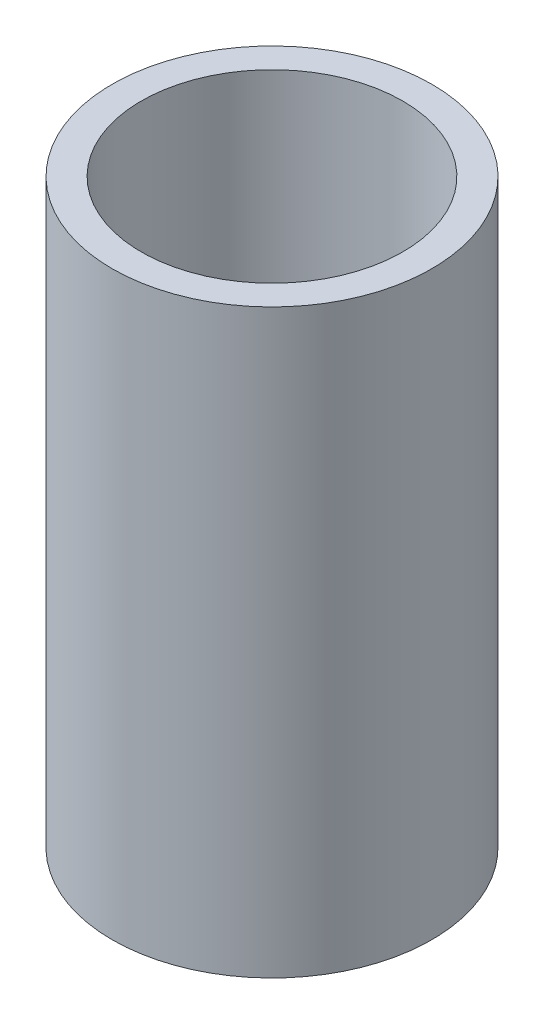
ISO-10303-21;
HEADER;
FILE_DESCRIPTION(('STEP AP214'),'2;1');
FILE_NAME('part.step','',(''),(''),'','','');
FILE_SCHEMA(('AUTOMOTIVE_DESIGN { 1 0 10303 214 1 1 1 1 }'));
ENDSEC;
DATA;
#1=APPLICATION_CONTEXT('core data for automotive mechanical design processes');
#2=APPLICATION_PROTOCOL_DEFINITION('international standard','automotive_design',2000,#1);
#3=PRODUCT_CONTEXT('',#1,'mechanical');
#4=PRODUCT('Part','Part','',(#3));
#5=PRODUCT_RELATED_PRODUCT_CATEGORY('part','',(#4));
#6=PRODUCT_DEFINITION_FORMATION('','',#4);
#7=PRODUCT_DEFINITION_CONTEXT('part definition',#1,'design');
#8=PRODUCT_DEFINITION('design','',#6,#7);
#9=PRODUCT_DEFINITION_SHAPE('','',#8);
#10=(LENGTH_UNIT() NAMED_UNIT(*) SI_UNIT(.MILLI.,.METRE.));
#11=(NAMED_UNIT(*) PLANE_ANGLE_UNIT() SI_UNIT($,.RADIAN.));
#12=(NAMED_UNIT(*) SI_UNIT($,.STERADIAN.) SOLID_ANGLE_UNIT());
#13=UNCERTAINTY_MEASURE_WITH_UNIT(LENGTH_MEASURE(1.E-05),#10,'distance_accuracy_value','');
#14=(GEOMETRIC_REPRESENTATION_CONTEXT(3) GLOBAL_UNCERTAINTY_ASSIGNED_CONTEXT((#13)) GLOBAL_UNIT_ASSIGNED_CONTEXT((#10,
#11,#12)) REPRESENTATION_CONTEXT('',''));
#15=CARTESIAN_POINT('',(0.,0.,0.));
#16=DIRECTION('',(0.,0.,1.));
#17=DIRECTION('',(1.,0.,0.));
#18=AXIS2_PLACEMENT_3D('',#15,#16,#17);
#19=CARTESIAN_POINT('',(0.,-110.603092707212,0.));
#20=DIRECTION('',(0.,-1.,0.));
#21=DIRECTION('',(0.,0.,-1.));
#22=AXIS2_PLACEMENT_3D('',#19,#20,#21);
#23=CYLINDRICAL_SURFACE('',#22,44.9999999999999);
#24=CARTESIAN_POINT('',(0.,-100.,0.));
#25=DIRECTION('',(0.,-1.,0.));
#26=DIRECTION('',(0.,0.,-1.));
#27=AXIS2_PLACEMENT_3D('',#24,#25,#26);
#28=CIRCLE('',#27,44.9999999999999);
#29=CARTESIAN_POINT('',(0.,-100.,-44.9999999999999));
#30=VERTEX_POINT('',#29);
#31=EDGE_CURVE('E10',#30,#30,#28,.T.);
#32=ORIENTED_EDGE('',*,*,#31,.T.);
#33=EDGE_LOOP('',(#32));
#34=FACE_BOUND('',#33,.T.);
#35=CARTESIAN_POINT('',(0.,100.,0.));
#36=DIRECTION('',(0.,-1.,0.));
#37=DIRECTION('',(0.,0.,-1.));
#38=AXIS2_PLACEMENT_3D('',#35,#36,#37);
#39=CIRCLE('',#38,44.9999999999999);
#40=CARTESIAN_POINT('',(0.,100.,-44.9999999999999));
#41=VERTEX_POINT('',#40);
#42=EDGE_CURVE('E49',#41,#41,#39,.T.);
#43=ORIENTED_EDGE('',*,*,#42,.F.);
#44=EDGE_LOOP('',(#43));
#45=FACE_BOUND('',#44,.T.);
#46=ADVANCED_FACE('F35',(#34,#45),#23,.F.);
#47=CARTESIAN_POINT('',(44.9999999999999,-100.,0.));
#48=DIRECTION('',(0.,-1.,0.));
#49=DIRECTION('',(0.,0.,-1.));
#50=AXIS2_PLACEMENT_3D('',#47,#48,#49);
#51=PLANE('',#50);
#52=CARTESIAN_POINT('',(0.,-100.,0.));
#53=DIRECTION('',(0.,-1.,0.));
#54=DIRECTION('',(0.,0.,-1.));
#55=AXIS2_PLACEMENT_3D('',#52,#53,#54);
#56=CIRCLE('',#55,54.9999999999999);
#57=CARTESIAN_POINT('',(0.,-100.,-54.9999999999999));
#58=VERTEX_POINT('',#57);
#59=EDGE_CURVE('E41',#58,#58,#56,.T.);
#60=ORIENTED_EDGE('',*,*,#59,.T.);
#61=EDGE_LOOP('',(#60));
#62=FACE_BOUND('',#61,.T.);
#63=ORIENTED_EDGE('',*,*,#31,.F.);
#64=EDGE_LOOP('',(#63));
#65=FACE_BOUND('',#64,.T.);
#66=ADVANCED_FACE('F59',(#62,#65),#51,.T.);
#67=CARTESIAN_POINT('',(0.,-110.603092707212,0.));
#68=DIRECTION('',(0.,-1.,0.));
#69=DIRECTION('',(0.,0.,-1.));
#70=AXIS2_PLACEMENT_3D('',#67,#68,#69);
#71=CYLINDRICAL_SURFACE('',#70,54.9999999999999);
#72=CARTESIAN_POINT('',(0.,100.,0.));
#73=DIRECTION('',(0.,-1.,0.));
#74=DIRECTION('',(0.,0.,-1.));
#75=AXIS2_PLACEMENT_3D('',#72,#73,#74);
#76=CIRCLE('',#75,54.9999999999999);
#77=CARTESIAN_POINT('',(0.,100.,-54.9999999999999));
#78=VERTEX_POINT('',#77);
#79=EDGE_CURVE('E45',#78,#78,#76,.T.);
#80=ORIENTED_EDGE('',*,*,#79,.T.);
#81=EDGE_LOOP('',(#80));
#82=FACE_BOUND('',#81,.T.);
#83=ORIENTED_EDGE('',*,*,#59,.F.);
#84=EDGE_LOOP('',(#83));
#85=FACE_BOUND('',#84,.T.);
#86=ADVANCED_FACE('F63',(#82,#85),#71,.T.);
#87=CARTESIAN_POINT('',(44.9999999999999,100.,0.));
#88=DIRECTION('',(0.,1.,0.));
#89=DIRECTION('',(0.,0.,1.));
#90=AXIS2_PLACEMENT_3D('',#87,#88,#89);
#91=PLANE('',#90);
#92=ORIENTED_EDGE('',*,*,#42,.T.);
#93=EDGE_LOOP('',(#92));
#94=FACE_BOUND('',#93,.T.);
#95=ORIENTED_EDGE('',*,*,#79,.F.);
#96=EDGE_LOOP('',(#95));
#97=FACE_BOUND('',#96,.T.);
#98=ADVANCED_FACE('F55',(#94,#97),#91,.T.);
#99=CLOSED_SHELL('',(#46,#66,#86,#98));
#100=MANIFOLD_SOLID_BREP('B2',#99);
#101=ADVANCED_BREP_SHAPE_REPRESENTATION('',(#18,#100),#14);
#102=SHAPE_DEFINITION_REPRESENTATION(#9,#101);
ENDSEC;
END-ISO-10303-21;
